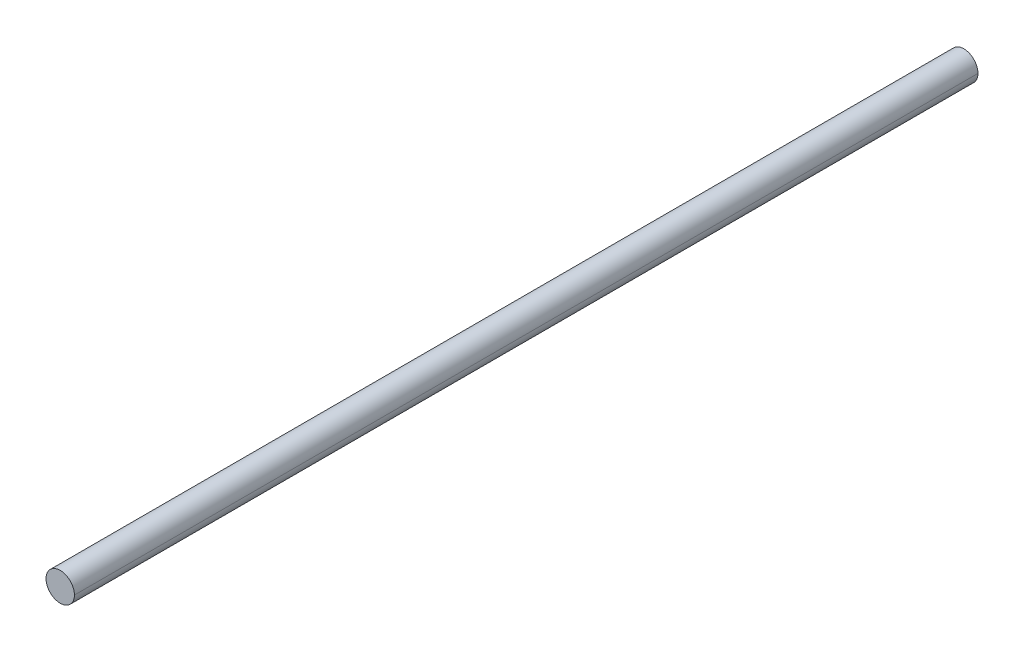
ISO-10303-21;
HEADER;
FILE_DESCRIPTION(('STEP AP214'),'2;1');
FILE_NAME('part.step','',(''),(''),'','','');
FILE_SCHEMA(('AUTOMOTIVE_DESIGN { 1 0 10303 214 1 1 1 1 }'));
ENDSEC;
DATA;
#1=APPLICATION_CONTEXT('core data for automotive mechanical design processes');
#2=APPLICATION_PROTOCOL_DEFINITION('international standard','automotive_design',2000,#1);
#3=PRODUCT_CONTEXT('',#1,'mechanical');
#4=PRODUCT('Part','Part','',(#3));
#5=PRODUCT_RELATED_PRODUCT_CATEGORY('part','',(#4));
#6=PRODUCT_DEFINITION_FORMATION('','',#4);
#7=PRODUCT_DEFINITION_CONTEXT('part definition',#1,'design');
#8=PRODUCT_DEFINITION('design','',#6,#7);
#9=PRODUCT_DEFINITION_SHAPE('','',#8);
#10=(LENGTH_UNIT() NAMED_UNIT(*) SI_UNIT(.MILLI.,.METRE.));
#11=(NAMED_UNIT(*) PLANE_ANGLE_UNIT() SI_UNIT($,.RADIAN.));
#12=(NAMED_UNIT(*) SI_UNIT($,.STERADIAN.) SOLID_ANGLE_UNIT());
#13=UNCERTAINTY_MEASURE_WITH_UNIT(LENGTH_MEASURE(1.E-05),#10,'distance_accuracy_value','');
#14=(GEOMETRIC_REPRESENTATION_CONTEXT(3) GLOBAL_UNCERTAINTY_ASSIGNED_CONTEXT((#13)) GLOBAL_UNIT_ASSIGNED_CONTEXT((#10,
#11,#12)) REPRESENTATION_CONTEXT('',''));
#15=CARTESIAN_POINT('',(0.,0.,0.));
#16=DIRECTION('',(0.,0.,1.));
#17=DIRECTION('',(1.,0.,0.));
#18=AXIS2_PLACEMENT_3D('',#15,#16,#17);
#19=CARTESIAN_POINT('',(0.,0.,0.));
#20=DIRECTION('',(0.,0.,1.));
#21=DIRECTION('',(1.,0.,0.));
#22=AXIS2_PLACEMENT_3D('',#19,#20,#21);
#23=PLANE('',#22);
#24=CARTESIAN_POINT('',(0.,0.,0.));
#25=DIRECTION('',(0.,0.,1.));
#26=DIRECTION('',(1.,0.,0.));
#27=AXIS2_PLACEMENT_3D('',#24,#25,#26);
#28=CIRCLE('',#27,9.5);
#29=CARTESIAN_POINT('',(-9.5,0.,0.));
#30=VERTEX_POINT('',#29);
#31=CARTESIAN_POINT('',(9.5,0.,0.));
#32=VERTEX_POINT('',#31);
#33=EDGE_CURVE('E10',#30,#32,#28,.T.);
#34=ORIENTED_EDGE('',*,*,#33,.F.);
#35=CARTESIAN_POINT('',(0.,0.,0.));
#36=DIRECTION('',(0.,0.,1.));
#37=DIRECTION('',(1.,0.,0.));
#38=AXIS2_PLACEMENT_3D('',#35,#36,#37);
#39=CIRCLE('',#38,9.5);
#40=EDGE_CURVE('E61',#32,#30,#39,.T.);
#41=ORIENTED_EDGE('',*,*,#40,.F.);
#42=EDGE_LOOP('',(#34,#41));
#43=FACE_BOUND('',#42,.T.);
#44=ADVANCED_FACE('F15',(#43),#23,.F.);
#45=CARTESIAN_POINT('',(0.,0.,603.2));
#46=DIRECTION('',(0.,0.,1.));
#47=DIRECTION('',(1.,0.,0.));
#48=AXIS2_PLACEMENT_3D('',#45,#46,#47);
#49=PLANE('',#48);
#50=CARTESIAN_POINT('',(0.,0.,603.2));
#51=DIRECTION('',(0.,0.,1.));
#52=DIRECTION('',(1.,0.,0.));
#53=AXIS2_PLACEMENT_3D('',#50,#51,#52);
#54=CIRCLE('',#53,9.5);
#55=CARTESIAN_POINT('',(-9.5,0.,603.2));
#56=VERTEX_POINT('',#55);
#57=CARTESIAN_POINT('',(9.5,0.,603.2));
#58=VERTEX_POINT('',#57);
#59=EDGE_CURVE('E26',#56,#58,#54,.T.);
#60=ORIENTED_EDGE('',*,*,#59,.T.);
#61=CARTESIAN_POINT('',(0.,0.,603.2));
#62=DIRECTION('',(0.,0.,1.));
#63=DIRECTION('',(1.,0.,0.));
#64=AXIS2_PLACEMENT_3D('',#61,#62,#63);
#65=CIRCLE('',#64,9.5);
#66=EDGE_CURVE('E60',#58,#56,#65,.T.);
#67=ORIENTED_EDGE('',*,*,#66,.T.);
#68=EDGE_LOOP('',(#60,#67));
#69=FACE_BOUND('',#68,.T.);
#70=ADVANCED_FACE('F64',(#69),#49,.T.);
#71=CARTESIAN_POINT('',(0.,0.,603.2));
#72=DIRECTION('',(0.,0.,-1.));
#73=DIRECTION('',(-1.,0.,0.));
#74=AXIS2_PLACEMENT_3D('',#71,#72,#73);
#75=CYLINDRICAL_SURFACE('',#74,9.5);
#76=DIRECTION('',(0.,0.,-1.));
#77=VECTOR('',#76,1.);
#78=CARTESIAN_POINT('',(9.5,0.,603.2));
#79=LINE('',#78,#77);
#80=EDGE_CURVE('E19',#58,#32,#79,.T.);
#81=ORIENTED_EDGE('',*,*,#80,.F.);
#82=ORIENTED_EDGE('',*,*,#59,.F.);
#83=DIRECTION('',(0.,0.,-1.));
#84=VECTOR('',#83,1.);
#85=CARTESIAN_POINT('',(-9.5,0.,603.2));
#86=LINE('',#85,#84);
#87=EDGE_CURVE('E51',#56,#30,#86,.T.);
#88=ORIENTED_EDGE('',*,*,#87,.T.);
#89=ORIENTED_EDGE('',*,*,#33,.T.);
#90=EDGE_LOOP('',(#81,#82,#88,#89));
#91=FACE_BOUND('',#90,.T.);
#92=ADVANCED_FACE('F17',(#91),#75,.T.);
#93=CARTESIAN_POINT('',(0.,0.,603.2));
#94=DIRECTION('',(0.,0.,-1.));
#95=DIRECTION('',(-1.,0.,0.));
#96=AXIS2_PLACEMENT_3D('',#93,#94,#95);
#97=CYLINDRICAL_SURFACE('',#96,9.5);
#98=ORIENTED_EDGE('',*,*,#66,.F.);
#99=ORIENTED_EDGE('',*,*,#80,.T.);
#100=ORIENTED_EDGE('',*,*,#40,.T.);
#101=ORIENTED_EDGE('',*,*,#87,.F.);
#102=EDGE_LOOP('',(#98,#99,#100,#101));
#103=FACE_BOUND('',#102,.T.);
#104=ADVANCED_FACE('F59',(#103),#97,.T.);
#105=CLOSED_SHELL('',(#44,#70,#92,#104));
#106=MANIFOLD_SOLID_BREP('B1',#105);
#107=ADVANCED_BREP_SHAPE_REPRESENTATION('',(#18,#106),#14);
#108=SHAPE_DEFINITION_REPRESENTATION(#9,#107);
ENDSEC;
END-ISO-10303-21;
